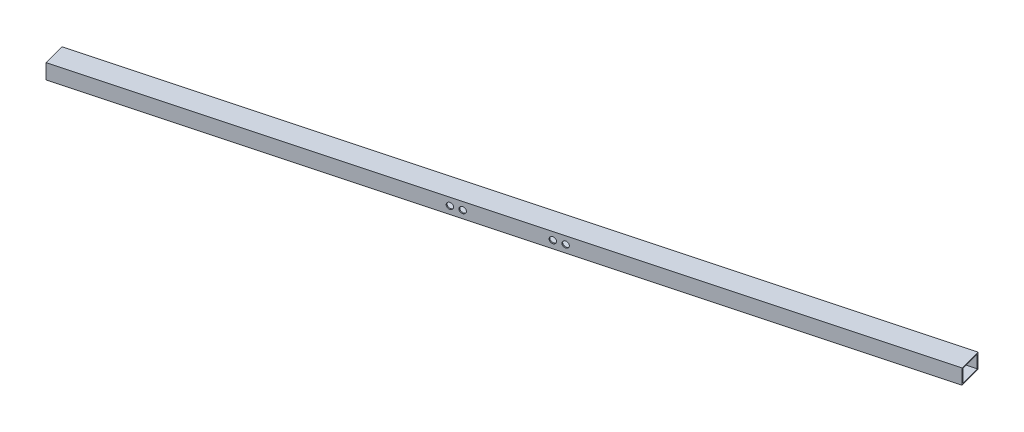
ISO-10303-21;
HEADER;
FILE_DESCRIPTION(('STEP AP214'),'2;1');
FILE_NAME('part.step','',(''),(''),'','','');
FILE_SCHEMA(('AUTOMOTIVE_DESIGN { 1 0 10303 214 1 1 1 1 }'));
ENDSEC;
DATA;
#1=APPLICATION_CONTEXT('core data for automotive mechanical design processes');
#2=APPLICATION_PROTOCOL_DEFINITION('international standard','automotive_design',2000,#1);
#3=PRODUCT_CONTEXT('',#1,'mechanical');
#4=PRODUCT('Part','Part','',(#3));
#5=PRODUCT_RELATED_PRODUCT_CATEGORY('part','',(#4));
#6=PRODUCT_DEFINITION_FORMATION('','',#4);
#7=PRODUCT_DEFINITION_CONTEXT('part definition',#1,'design');
#8=PRODUCT_DEFINITION('design','',#6,#7);
#9=PRODUCT_DEFINITION_SHAPE('','',#8);
#10=(LENGTH_UNIT() NAMED_UNIT(*) SI_UNIT(.MILLI.,.METRE.));
#11=(NAMED_UNIT(*) PLANE_ANGLE_UNIT() SI_UNIT($,.RADIAN.));
#12=(NAMED_UNIT(*) SI_UNIT($,.STERADIAN.) SOLID_ANGLE_UNIT());
#13=UNCERTAINTY_MEASURE_WITH_UNIT(LENGTH_MEASURE(1.E-05),#10,'distance_accuracy_value','');
#14=(GEOMETRIC_REPRESENTATION_CONTEXT(3) GLOBAL_UNCERTAINTY_ASSIGNED_CONTEXT((#13)) GLOBAL_UNIT_ASSIGNED_CONTEXT((#10,
#11,#12)) REPRESENTATION_CONTEXT('',''));
#15=CARTESIAN_POINT('',(0.,0.,0.));
#16=DIRECTION('',(0.,0.,1.));
#17=DIRECTION('',(1.,0.,0.));
#18=AXIS2_PLACEMENT_3D('',#15,#16,#17);
#19=CARTESIAN_POINT('',(-122.2588190451,0.,2028.32641603));
#20=DIRECTION('',(0.258819045102985,0.,0.965925826288944));
#21=DIRECTION('',(0.965925826288944,0.,-0.258819045102985));
#22=AXIS2_PLACEMENT_3D('',#19,#20,#21);
#23=CYLINDRICAL_SURFACE('',#22,8.1);
#24=DIRECTION('',(0.258819045102985,0.,0.965925826288944));
#25=VECTOR('',#24,1.);
#26=CARTESIAN_POINT('',(-114.4348198521,0.,2026.229981765));
#27=LINE('',#26,#25);
#28=CARTESIAN_POINT('',(-99.42331523607,0.,2082.25367969));
#29=VERTEX_POINT('',#28);
#30=CARTESIAN_POINT('',(-98.64685810073,0.,2085.151457169));
#31=VERTEX_POINT('',#30);
#32=EDGE_CURVE('E11',#29,#31,#27,.T.);
#33=ORIENTED_EDGE('',*,*,#32,.F.);
#34=CARTESIAN_POINT('',(-107.247314429,0.,2084.350113955));
#35=DIRECTION('',(0.258819045102985,0.,0.965925826288944));
#36=DIRECTION('',(0.965925826288944,0.,-0.258819045102985));
#37=AXIS2_PLACEMENT_3D('',#34,#35,#36);
#38=CIRCLE('',#37,8.1);
#39=EDGE_CURVE('E225',#29,#29,#38,.T.);
#40=ORIENTED_EDGE('',*,*,#39,.F.);
#41=ORIENTED_EDGE('',*,*,#32,.T.);
#42=CARTESIAN_POINT('',(-106.4708572936,0.,2087.247891434));
#43=DIRECTION('',(0.258819045102985,0.,0.965925826288944));
#44=DIRECTION('',(0.965925826288944,0.,-0.258819045102985));
#45=AXIS2_PLACEMENT_3D('',#42,#43,#44);
#46=CIRCLE('',#45,8.1);
#47=EDGE_CURVE('E287',#31,#31,#46,.T.);
#48=ORIENTED_EDGE('',*,*,#47,.T.);
#49=EDGE_LOOP('',(#33,#40,#41,#48));
#50=FACE_BOUND('',#49,.T.);
#51=ADVANCED_FACE('F17',(#50),#23,.F.);
#52=CARTESIAN_POINT('',(-95.2588190451,0.,2021.091787834));
#53=DIRECTION('',(0.258819045102985,0.,0.965925826288944));
#54=DIRECTION('',(0.965925826288944,0.,-0.258819045102985));
#55=AXIS2_PLACEMENT_3D('',#52,#53,#54);
#56=CYLINDRICAL_SURFACE('',#55,8.1);
#57=DIRECTION('',(0.258819045102985,0.,0.965925826288944));
#58=VECTOR('',#57,1.);
#59=CARTESIAN_POINT('',(-87.43481985216,0.,2018.995353569));
#60=LINE('',#59,#58);
#61=CARTESIAN_POINT('',(-72.42331523607,0.,2075.019051494));
#62=VERTEX_POINT('',#61);
#63=CARTESIAN_POINT('',(-71.64685810073,0.,2077.916828973));
#64=VERTEX_POINT('',#63);
#65=EDGE_CURVE('E25',#62,#64,#60,.T.);
#66=ORIENTED_EDGE('',*,*,#65,.F.);
#67=CARTESIAN_POINT('',(-80.24731442901,0.,2077.115485759));
#68=DIRECTION('',(0.258819045102985,0.,0.965925826288944));
#69=DIRECTION('',(0.965925826288944,0.,-0.258819045102985));
#70=AXIS2_PLACEMENT_3D('',#67,#68,#69);
#71=CIRCLE('',#70,8.1);
#72=EDGE_CURVE('E242',#62,#62,#71,.T.);
#73=ORIENTED_EDGE('',*,*,#72,.F.);
#74=ORIENTED_EDGE('',*,*,#65,.T.);
#75=CARTESIAN_POINT('',(-79.47085729367,0.,2080.013263238));
#76=DIRECTION('',(0.258819045102985,0.,0.965925826288944));
#77=DIRECTION('',(0.965925826288944,0.,-0.258819045102985));
#78=AXIS2_PLACEMENT_3D('',#75,#76,#77);
#79=CIRCLE('',#78,8.1);
#80=EDGE_CURVE('E329',#64,#64,#79,.T.);
#81=ORIENTED_EDGE('',*,*,#80,.T.);
#82=EDGE_LOOP('',(#66,#73,#74,#81));
#83=FACE_BOUND('',#82,.T.);
#84=ADVANCED_FACE('F346',(#83),#56,.F.);
#85=CARTESIAN_POINT('',(94.741180954897,0.,1970.181441272));
#86=DIRECTION('',(0.258819045102985,0.,0.965925826288944));
#87=DIRECTION('',(0.965925826288944,0.,-0.258819045102985));
#88=AXIS2_PLACEMENT_3D('',#85,#86,#87);
#89=CYLINDRICAL_SURFACE('',#88,8.1);
#90=DIRECTION('',(0.258819045102985,0.,0.965925826288944));
#91=VECTOR('',#90,1.);
#92=CARTESIAN_POINT('',(102.56518014783,0.,1968.085007007));
#93=LINE('',#92,#91);
#94=CARTESIAN_POINT('',(117.57668476389,0.,2024.108704932));
#95=VERTEX_POINT('',#94);
#96=CARTESIAN_POINT('',(118.35314189923,0.,2027.006482411));
#97=VERTEX_POINT('',#96);
#98=EDGE_CURVE('E342',#95,#97,#93,.T.);
#99=ORIENTED_EDGE('',*,*,#98,.F.);
#100=CARTESIAN_POINT('',(109.75268557095,0.,2026.205139197));
#101=DIRECTION('',(0.258819045102985,0.,0.965925826288944));
#102=DIRECTION('',(0.965925826288944,0.,-0.258819045102985));
#103=AXIS2_PLACEMENT_3D('',#100,#101,#102);
#104=CIRCLE('',#103,8.1);
#105=EDGE_CURVE('E238',#95,#95,#104,.T.);
#106=ORIENTED_EDGE('',*,*,#105,.F.);
#107=ORIENTED_EDGE('',*,*,#98,.T.);
#108=CARTESIAN_POINT('',(110.52914270629,0.,2029.102916676));
#109=DIRECTION('',(0.258819045102985,0.,0.965925826288944));
#110=DIRECTION('',(0.965925826288944,0.,-0.258819045102985));
#111=AXIS2_PLACEMENT_3D('',#108,#109,#110);
#112=CIRCLE('',#111,8.1);
#113=EDGE_CURVE('E325',#97,#97,#112,.T.);
#114=ORIENTED_EDGE('',*,*,#113,.T.);
#115=EDGE_LOOP('',(#99,#106,#107,#114));
#116=FACE_BOUND('',#115,.T.);
#117=ADVANCED_FACE('F387',(#116),#89,.F.);
#118=CARTESIAN_POINT('',(121.74118095489,0.,1962.946813077));
#119=DIRECTION('',(0.258819045102985,0.,0.965925826288944));
#120=DIRECTION('',(0.965925826288944,0.,-0.258819045102985));
#121=AXIS2_PLACEMENT_3D('',#118,#119,#120);
#122=CYLINDRICAL_SURFACE('',#121,8.1);
#123=DIRECTION('',(0.258819045102985,0.,0.965925826288944));
#124=VECTOR('',#123,1.);
#125=CARTESIAN_POINT('',(129.56518014783,0.,1960.850378811));
#126=LINE('',#125,#124);
#127=CARTESIAN_POINT('',(144.57668476389,0.,2016.874076736));
#128=VERTEX_POINT('',#127);
#129=CARTESIAN_POINT('',(145.35314189923,0.,2019.771854215));
#130=VERTEX_POINT('',#129);
#131=EDGE_CURVE('E224',#128,#130,#126,.T.);
#132=ORIENTED_EDGE('',*,*,#131,.F.);
#133=CARTESIAN_POINT('',(136.75268557095,0.,2018.970511002));
#134=DIRECTION('',(0.258819045102985,0.,0.965925826288944));
#135=DIRECTION('',(0.965925826288944,0.,-0.258819045102985));
#136=AXIS2_PLACEMENT_3D('',#133,#134,#135);
#137=CIRCLE('',#136,8.1);
#138=EDGE_CURVE('E243',#128,#128,#137,.T.);
#139=ORIENTED_EDGE('',*,*,#138,.F.);
#140=ORIENTED_EDGE('',*,*,#131,.T.);
#141=CARTESIAN_POINT('',(137.52914270629,0.,2021.868288481));
#142=DIRECTION('',(0.258819045102985,0.,0.965925826288944));
#143=DIRECTION('',(0.965925826288944,0.,-0.258819045102985));
#144=AXIS2_PLACEMENT_3D('',#141,#142,#143);
#145=CIRCLE('',#144,8.1);
#146=EDGE_CURVE('E206',#130,#130,#145,.T.);
#147=ORIENTED_EDGE('',*,*,#146,.T.);
#148=EDGE_LOOP('',(#132,#139,#140,#147));
#149=FACE_BOUND('',#148,.T.);
#150=ADVANCED_FACE('F377',(#149),#122,.F.);
#151=CARTESIAN_POINT('',(-972.9139405062,-17.,2260.399873585));
#152=DIRECTION('',(0.258819045102985,0.,0.965925826288944));
#153=DIRECTION('',(0.,-1.,0.));
#154=AXIS2_PLACEMENT_3D('',#151,#152,#153);
#155=PLANE('',#154);
#156=CARTESIAN_POINT('',(-121.2235428646,0.,2032.190119335));
#157=DIRECTION('',(0.258819045102985,0.,0.965925826288944));
#158=DIRECTION('',(0.965925826288944,0.,-0.258819045102985));
#159=AXIS2_PLACEMENT_3D('',#156,#157,#158);
#160=CIRCLE('',#159,8.1);
#161=CARTESIAN_POINT('',(-113.3995436717,0.,2030.09368507));
#162=VERTEX_POINT('',#161);
#163=EDGE_CURVE('E205',#162,#162,#160,.T.);
#164=ORIENTED_EDGE('',*,*,#163,.F.);
#165=EDGE_LOOP('',(#164));
#166=FACE_BOUND('',#165,.T.);
#167=CARTESIAN_POINT('',(-94.22354286464,0.,2024.95549114));
#168=DIRECTION('',(0.258819045102985,0.,0.965925826288944));
#169=DIRECTION('',(0.965925826288944,0.,-0.258819045102985));
#170=AXIS2_PLACEMENT_3D('',#167,#168,#169);
#171=CIRCLE('',#170,8.1);
#172=CARTESIAN_POINT('',(-86.3995436717,0.,2022.859056874));
#173=VERTEX_POINT('',#172);
#174=EDGE_CURVE('E316',#173,#173,#171,.T.);
#175=ORIENTED_EDGE('',*,*,#174,.F.);
#176=EDGE_LOOP('',(#175));
#177=FACE_BOUND('',#176,.T.);
#178=CARTESIAN_POINT('',(95.776457135327,0.,1974.045144578));
#179=DIRECTION('',(0.258819045102985,0.,0.965925826288944));
#180=DIRECTION('',(0.965925826288944,0.,-0.258819045102985));
#181=AXIS2_PLACEMENT_3D('',#178,#179,#180);
#182=CIRCLE('',#181,8.1);
#183=CARTESIAN_POINT('',(103.60045632826,0.,1971.948710312));
#184=VERTEX_POINT('',#183);
#185=EDGE_CURVE('E305',#184,#184,#182,.T.);
#186=ORIENTED_EDGE('',*,*,#185,.F.);
#187=EDGE_LOOP('',(#186));
#188=FACE_BOUND('',#187,.T.);
#189=CARTESIAN_POINT('',(122.77645713532,0.,1966.810516382));
#190=DIRECTION('',(0.258819045102985,0.,0.965925826288944));
#191=DIRECTION('',(0.965925826288944,0.,-0.258819045102985));
#192=AXIS2_PLACEMENT_3D('',#189,#190,#191);
#193=CIRCLE('',#192,8.1);
#194=CARTESIAN_POINT('',(130.60045632826,0.,1964.714082117));
#195=VERTEX_POINT('',#194);
#196=EDGE_CURVE('E298',#195,#195,#193,.T.);
#197=ORIENTED_EDGE('',*,*,#196,.F.);
#198=EDGE_LOOP('',(#197));
#199=FACE_BOUND('',#198,.T.);
#200=DIRECTION('',(0.965925826288944,0.,-0.258819045102985));
#201=VECTOR('',#200,1.);
#202=CARTESIAN_POINT('',(-972.9139405062,-17.,2260.399873585));
#203=LINE('',#202,#201);
#204=CARTESIAN_POINT('',(-972.9139405062,-17.,2260.399873585));
#205=VERTEX_POINT('',#204);
#206=CARTESIAN_POINT('',(958.93771207186,-17.,1742.76178338));
#207=VERTEX_POINT('',#206);
#208=EDGE_CURVE('E286',#205,#207,#203,.T.);
#209=ORIENTED_EDGE('',*,*,#208,.T.);
#210=DIRECTION('',(0.,1.,0.));
#211=VECTOR('',#210,1.);
#212=CARTESIAN_POINT('',(958.93771207186,-17.,1742.76178338));
#213=LINE('',#212,#211);
#214=CARTESIAN_POINT('',(958.93771207186,17.,1742.76178338));
#215=VERTEX_POINT('',#214);
#216=EDGE_CURVE('E282',#207,#215,#213,.T.);
#217=ORIENTED_EDGE('',*,*,#216,.T.);
#218=DIRECTION('',(0.965925826288944,0.,-0.258819045102985));
#219=VECTOR('',#218,1.);
#220=CARTESIAN_POINT('',(-972.9139405062,17.,2260.399873585));
#221=LINE('',#220,#219);
#222=CARTESIAN_POINT('',(-972.9139405062,17.,2260.399873585));
#223=VERTEX_POINT('',#222);
#224=EDGE_CURVE('E221',#223,#215,#221,.T.);
#225=ORIENTED_EDGE('',*,*,#224,.F.);
#226=DIRECTION('',(0.,1.,0.));
#227=VECTOR('',#226,1.);
#228=CARTESIAN_POINT('',(-972.9139405062,-17.,2260.399873585));
#229=LINE('',#228,#227);
#230=EDGE_CURVE('E246',#205,#223,#229,.T.);
#231=ORIENTED_EDGE('',*,*,#230,.F.);
#232=EDGE_LOOP('',(#209,#217,#225,#231));
#233=FACE_BOUND('',#232,.T.);
#234=ADVANCED_FACE('F375',(#166,#177,#188,#199,#233),#155,.T.);
#235=CARTESIAN_POINT('',(-972.9139405062,17.,2260.399873585));
#236=DIRECTION('',(0.,-1.,0.));
#237=DIRECTION('',(0.,0.,-1.));
#238=AXIS2_PLACEMENT_3D('',#235,#236,#237);
#239=PLANE('',#238);
#240=ORIENTED_EDGE('',*,*,#224,.T.);
#241=DIRECTION('',(0.258819045102985,0.,0.965925826288944));
#242=VECTOR('',#241,1.);
#243=CARTESIAN_POINT('',(958.93771207186,17.,1742.76178338));
#244=LINE('',#243,#242);
#245=CARTESIAN_POINT('',(972.9139405074,17.,1794.921778));
#246=VERTEX_POINT('',#245);
#247=EDGE_CURVE('E278',#215,#246,#244,.T.);
#248=ORIENTED_EDGE('',*,*,#247,.T.);
#249=DIRECTION('',(0.965925826288944,0.,-0.258819045102985));
#250=VECTOR('',#249,1.);
#251=CARTESIAN_POINT('',(-958.9377120707,17.,2312.559868205));
#252=LINE('',#251,#250);
#253=CARTESIAN_POINT('',(-958.9377120707,17.,2312.559868205));
#254=VERTEX_POINT('',#253);
#255=EDGE_CURVE('E309',#254,#246,#252,.T.);
#256=ORIENTED_EDGE('',*,*,#255,.F.);
#257=DIRECTION('',(0.258819045102985,0.,0.965925826288944));
#258=VECTOR('',#257,1.);
#259=CARTESIAN_POINT('',(-972.9139405062,17.,2260.399873585));
#260=LINE('',#259,#258);
#261=EDGE_CURVE('E220',#223,#254,#260,.T.);
#262=ORIENTED_EDGE('',*,*,#261,.F.);
#263=EDGE_LOOP('',(#240,#248,#256,#262));
#264=FACE_BOUND('',#263,.T.);
#265=ADVANCED_FACE('F353',(#264),#239,.T.);
#266=CARTESIAN_POINT('',(-958.9377120707,17.,2312.559868205));
#267=DIRECTION('',(-0.258819045102985,0.,-0.965925826288944));
#268=DIRECTION('',(-0.965925826288944,0.,0.258819045102985));
#269=AXIS2_PLACEMENT_3D('',#266,#267,#268);
#270=PLANE('',#269);
#271=ORIENTED_EDGE('',*,*,#39,.T.);
#272=EDGE_LOOP('',(#271));
#273=FACE_BOUND('',#272,.T.);
#274=ORIENTED_EDGE('',*,*,#72,.T.);
#275=EDGE_LOOP('',(#274));
#276=FACE_BOUND('',#275,.T.);
#277=ORIENTED_EDGE('',*,*,#105,.T.);
#278=EDGE_LOOP('',(#277));
#279=FACE_BOUND('',#278,.T.);
#280=ORIENTED_EDGE('',*,*,#138,.T.);
#281=EDGE_LOOP('',(#280));
#282=FACE_BOUND('',#281,.T.);
#283=ORIENTED_EDGE('',*,*,#255,.T.);
#284=DIRECTION('',(0.,-1.,0.));
#285=VECTOR('',#284,1.);
#286=CARTESIAN_POINT('',(972.9139405074,17.,1794.921778));
#287=LINE('',#286,#285);
#288=CARTESIAN_POINT('',(972.9139405074,-17.,1794.921778));
#289=VERTEX_POINT('',#288);
#290=EDGE_CURVE('E274',#246,#289,#287,.T.);
#291=ORIENTED_EDGE('',*,*,#290,.T.);
#292=DIRECTION('',(0.965925826288944,0.,-0.258819045102985));
#293=VECTOR('',#292,1.);
#294=CARTESIAN_POINT('',(-958.9377120707,-17.,2312.559868205));
#295=LINE('',#294,#293);
#296=CARTESIAN_POINT('',(-958.9377120707,-17.,2312.559868205));
#297=VERTEX_POINT('',#296);
#298=EDGE_CURVE('E283',#297,#289,#295,.T.);
#299=ORIENTED_EDGE('',*,*,#298,.F.);
#300=DIRECTION('',(0.,-1.,0.));
#301=VECTOR('',#300,1.);
#302=CARTESIAN_POINT('',(-958.9377120707,17.,2312.559868205));
#303=LINE('',#302,#301);
#304=EDGE_CURVE('E215',#254,#297,#303,.T.);
#305=ORIENTED_EDGE('',*,*,#304,.F.);
#306=EDGE_LOOP('',(#283,#291,#299,#305));
#307=FACE_BOUND('',#306,.T.);
#308=ADVANCED_FACE('F349',(#273,#276,#279,#282,#307),#270,.T.);
#309=CARTESIAN_POINT('',(-958.9377120707,-17.,2312.559868205));
#310=DIRECTION('',(0.,1.,0.));
#311=DIRECTION('',(1.,0.,0.));
#312=AXIS2_PLACEMENT_3D('',#309,#310,#311);
#313=PLANE('',#312);
#314=ORIENTED_EDGE('',*,*,#298,.T.);
#315=DIRECTION('',(-0.258819045102985,0.,-0.965925826288944));
#316=VECTOR('',#315,1.);
#317=CARTESIAN_POINT('',(972.9139405074,-17.,1794.921778));
#318=LINE('',#317,#316);
#319=EDGE_CURVE('E270',#289,#207,#318,.T.);
#320=ORIENTED_EDGE('',*,*,#319,.T.);
#321=ORIENTED_EDGE('',*,*,#208,.F.);
#322=DIRECTION('',(-0.258819045102985,0.,-0.965925826288944));
#323=VECTOR('',#322,1.);
#324=CARTESIAN_POINT('',(-958.9377120707,-17.,2312.559868205));
#325=LINE('',#324,#323);
#326=EDGE_CURVE('E219',#297,#205,#325,.T.);
#327=ORIENTED_EDGE('',*,*,#326,.F.);
#328=EDGE_LOOP('',(#314,#320,#321,#327));
#329=FACE_BOUND('',#328,.T.);
#330=ADVANCED_FACE('F352',(#329),#313,.T.);
#331=CARTESIAN_POINT('',(-958.1612549354,20.,2315.457645684));
#332=DIRECTION('',(-0.258819045102985,0.,-0.965925826288944));
#333=DIRECTION('',(-0.965925826288944,0.,0.258819045102985));
#334=AXIS2_PLACEMENT_3D('',#331,#332,#333);
#335=PLANE('',#334);
#336=ORIENTED_EDGE('',*,*,#47,.F.);
#337=EDGE_LOOP('',(#336));
#338=FACE_BOUND('',#337,.T.);
#339=ORIENTED_EDGE('',*,*,#80,.F.);
#340=EDGE_LOOP('',(#339));
#341=FACE_BOUND('',#340,.T.);
#342=ORIENTED_EDGE('',*,*,#113,.F.);
#343=EDGE_LOOP('',(#342));
#344=FACE_BOUND('',#343,.T.);
#345=ORIENTED_EDGE('',*,*,#146,.F.);
#346=EDGE_LOOP('',(#345));
#347=FACE_BOUND('',#346,.T.);
#348=DIRECTION('',(0.,-1.,0.));
#349=VECTOR('',#348,1.);
#350=CARTESIAN_POINT('',(-958.1612549354,20.,2315.457645684));
#351=LINE('',#350,#349);
#352=CARTESIAN_POINT('',(-958.1612549354,20.,2315.457645684));
#353=VERTEX_POINT('',#352);
#354=CARTESIAN_POINT('',(-958.1612549354,-20.,2315.457645684));
#355=VERTEX_POINT('',#354);
#356=EDGE_CURVE('E247',#353,#355,#351,.T.);
#357=ORIENTED_EDGE('',*,*,#356,.T.);
#358=DIRECTION('',(0.965925826288944,0.,-0.258819045102985));
#359=VECTOR('',#358,1.);
#360=CARTESIAN_POINT('',(-958.1612549354,-20.,2315.457645684));
#361=LINE('',#360,#359);
#362=CARTESIAN_POINT('',(973.69039764271,-20.,1797.819555479));
#363=VERTEX_POINT('',#362);
#364=EDGE_CURVE('E175',#355,#363,#361,.T.);
#365=ORIENTED_EDGE('',*,*,#364,.T.);
#366=DIRECTION('',(0.,-1.,0.));
#367=VECTOR('',#366,1.);
#368=CARTESIAN_POINT('',(973.69039764271,20.,1797.819555479));
#369=LINE('',#368,#367);
#370=CARTESIAN_POINT('',(973.69039764271,20.,1797.819555479));
#371=VERTEX_POINT('',#370);
#372=EDGE_CURVE('E265',#371,#363,#369,.T.);
#373=ORIENTED_EDGE('',*,*,#372,.F.);
#374=DIRECTION('',(0.965925826288944,0.,-0.258819045102985));
#375=VECTOR('',#374,1.);
#376=CARTESIAN_POINT('',(-958.1612549354,20.,2315.457645684));
#377=LINE('',#376,#375);
#378=EDGE_CURVE('E291',#353,#371,#377,.T.);
#379=ORIENTED_EDGE('',*,*,#378,.F.);
#380=EDGE_LOOP('',(#357,#365,#373,#379));
#381=FACE_BOUND('',#380,.T.);
#382=ADVANCED_FACE('F434',(#338,#341,#344,#347,#381),#335,.F.);
#383=CARTESIAN_POINT('',(-122.2588190451,0.,2028.32641603));
#384=DIRECTION('',(0.258819045102985,0.,0.965925826288944));
#385=DIRECTION('',(0.965925826288944,0.,-0.258819045102985));
#386=AXIS2_PLACEMENT_3D('',#383,#384,#385);
#387=CYLINDRICAL_SURFACE('',#386,8.1);
#388=DIRECTION('',(0.258819045102985,0.,0.965925826288944));
#389=VECTOR('',#388,1.);
#390=CARTESIAN_POINT('',(-114.4348198521,0.,2026.229981765));
#391=LINE('',#390,#389);
#392=CARTESIAN_POINT('',(-114.176000807,0.,2027.195907591));
#393=VERTEX_POINT('',#392);
#394=EDGE_CURVE('E207',#393,#162,#391,.T.);
#395=ORIENTED_EDGE('',*,*,#394,.F.);
#396=CARTESIAN_POINT('',(-121.9999999999,0.,2029.292341856));
#397=DIRECTION('',(0.258819045102985,0.,0.965925826288944));
#398=DIRECTION('',(0.965925826288944,0.,-0.258819045102985));
#399=AXIS2_PLACEMENT_3D('',#396,#397,#398);
#400=CIRCLE('',#399,8.1);
#401=EDGE_CURVE('E181',#393,#393,#400,.T.);
#402=ORIENTED_EDGE('',*,*,#401,.F.);
#403=ORIENTED_EDGE('',*,*,#394,.T.);
#404=ORIENTED_EDGE('',*,*,#163,.T.);
#405=EDGE_LOOP('',(#395,#402,#403,#404));
#406=FACE_BOUND('',#405,.T.);
#407=ADVANCED_FACE('F415',(#406),#387,.F.);
#408=CARTESIAN_POINT('',(-95.2588190451,0.,2021.091787834));
#409=DIRECTION('',(0.258819045102985,0.,0.965925826288944));
#410=DIRECTION('',(0.965925826288944,0.,-0.258819045102985));
#411=AXIS2_PLACEMENT_3D('',#408,#409,#410);
#412=CYLINDRICAL_SURFACE('',#411,8.1);
#413=DIRECTION('',(0.258819045102985,0.,0.965925826288944));
#414=VECTOR('',#413,1.);
#415=CARTESIAN_POINT('',(-87.43481985216,0.,2018.995353569));
#416=LINE('',#415,#414);
#417=CARTESIAN_POINT('',(-87.17600080704,0.,2019.961279395));
#418=VERTEX_POINT('',#417);
#419=EDGE_CURVE('E312',#418,#173,#416,.T.);
#420=ORIENTED_EDGE('',*,*,#419,.F.);
#421=CARTESIAN_POINT('',(-94.99999999998,0.,2022.057713661));
#422=DIRECTION('',(0.258819045102985,0.,0.965925826288944));
#423=DIRECTION('',(0.965925826288944,0.,-0.258819045102985));
#424=AXIS2_PLACEMENT_3D('',#421,#422,#423);
#425=CIRCLE('',#424,8.1);
#426=EDGE_CURVE('E213',#418,#418,#425,.T.);
#427=ORIENTED_EDGE('',*,*,#426,.F.);
#428=ORIENTED_EDGE('',*,*,#419,.T.);
#429=ORIENTED_EDGE('',*,*,#174,.T.);
#430=EDGE_LOOP('',(#420,#427,#428,#429));
#431=FACE_BOUND('',#430,.T.);
#432=ADVANCED_FACE('F411',(#431),#412,.F.);
#433=CARTESIAN_POINT('',(94.741180954897,0.,1970.181441272));
#434=DIRECTION('',(0.258819045102985,0.,0.965925826288944));
#435=DIRECTION('',(0.965925826288944,0.,-0.258819045102985));
#436=AXIS2_PLACEMENT_3D('',#433,#434,#435);
#437=CYLINDRICAL_SURFACE('',#436,8.1);
#438=DIRECTION('',(0.258819045102985,0.,0.965925826288944));
#439=VECTOR('',#438,1.);
#440=CARTESIAN_POINT('',(102.56518014783,0.,1968.085007007));
#441=LINE('',#440,#439);
#442=CARTESIAN_POINT('',(102.82399919292,0.,1969.050932833));
#443=VERTEX_POINT('',#442);
#444=EDGE_CURVE('E301',#443,#184,#441,.T.);
#445=ORIENTED_EDGE('',*,*,#444,.F.);
#446=CARTESIAN_POINT('',(94.999999999987,0.,1971.147367099));
#447=DIRECTION('',(0.258819045102985,0.,0.965925826288944));
#448=DIRECTION('',(0.965925826288944,0.,-0.258819045102985));
#449=AXIS2_PLACEMENT_3D('',#446,#447,#448);
#450=CIRCLE('',#449,8.1);
#451=EDGE_CURVE('E229',#443,#443,#450,.T.);
#452=ORIENTED_EDGE('',*,*,#451,.F.);
#453=ORIENTED_EDGE('',*,*,#444,.T.);
#454=ORIENTED_EDGE('',*,*,#185,.T.);
#455=EDGE_LOOP('',(#445,#452,#453,#454));
#456=FACE_BOUND('',#455,.T.);
#457=ADVANCED_FACE('F414',(#456),#437,.F.);
#458=CARTESIAN_POINT('',(121.74118095489,0.,1962.946813077));
#459=DIRECTION('',(0.258819045102985,0.,0.965925826288944));
#460=DIRECTION('',(0.965925826288944,0.,-0.258819045102985));
#461=AXIS2_PLACEMENT_3D('',#458,#459,#460);
#462=CYLINDRICAL_SURFACE('',#461,8.1);
#463=DIRECTION('',(0.258819045102985,0.,0.965925826288944));
#464=VECTOR('',#463,1.);
#465=CARTESIAN_POINT('',(129.56518014783,0.,1960.850378811));
#466=LINE('',#465,#464);
#467=CARTESIAN_POINT('',(129.82399919292,0.,1961.816304638));
#468=VERTEX_POINT('',#467);
#469=EDGE_CURVE('E294',#468,#195,#466,.T.);
#470=ORIENTED_EDGE('',*,*,#469,.F.);
#471=CARTESIAN_POINT('',(121.99999999998,0.,1963.912738903));
#472=DIRECTION('',(0.258819045102985,0.,0.965925826288944));
#473=DIRECTION('',(0.965925826288944,0.,-0.258819045102985));
#474=AXIS2_PLACEMENT_3D('',#471,#472,#473);
#475=CIRCLE('',#474,8.1);
#476=EDGE_CURVE('E191',#468,#468,#475,.T.);
#477=ORIENTED_EDGE('',*,*,#476,.F.);
#478=ORIENTED_EDGE('',*,*,#469,.T.);
#479=ORIENTED_EDGE('',*,*,#196,.T.);
#480=EDGE_LOOP('',(#470,#477,#478,#479));
#481=FACE_BOUND('',#480,.T.);
#482=ADVANCED_FACE('F423',(#481),#462,.F.);
#483=CARTESIAN_POINT('',(-973.6903976415,20.,2257.502096106));
#484=DIRECTION('',(0.,-1.,0.));
#485=DIRECTION('',(0.,0.,-1.));
#486=AXIS2_PLACEMENT_3D('',#483,#484,#485);
#487=PLANE('',#486);
#488=DIRECTION('',(0.258819045102985,0.,0.965925826288944));
#489=VECTOR('',#488,1.);
#490=CARTESIAN_POINT('',(-973.6903976415,20.,2257.502096106));
#491=LINE('',#490,#489);
#492=CARTESIAN_POINT('',(-973.6903976415,20.,2257.502096106));
#493=VERTEX_POINT('',#492);
#494=EDGE_CURVE('E195',#493,#353,#491,.T.);
#495=ORIENTED_EDGE('',*,*,#494,.T.);
#496=ORIENTED_EDGE('',*,*,#378,.T.);
#497=DIRECTION('',(0.258819045102985,0.,0.965925826288944));
#498=VECTOR('',#497,1.);
#499=CARTESIAN_POINT('',(958.16125493656,20.,1739.864005901));
#500=LINE('',#499,#498);
#501=CARTESIAN_POINT('',(958.16125493656,20.,1739.864005901));
#502=VERTEX_POINT('',#501);
#503=EDGE_CURVE('E261',#502,#371,#500,.T.);
#504=ORIENTED_EDGE('',*,*,#503,.F.);
#505=DIRECTION('',(0.965925826288944,0.,-0.258819045102985));
#506=VECTOR('',#505,1.);
#507=CARTESIAN_POINT('',(-973.6903976415,20.,2257.502096106));
#508=LINE('',#507,#506);
#509=EDGE_CURVE('E198',#493,#502,#508,.T.);
#510=ORIENTED_EDGE('',*,*,#509,.F.);
#511=EDGE_LOOP('',(#495,#496,#504,#510));
#512=FACE_BOUND('',#511,.T.);
#513=ADVANCED_FACE('F421',(#512),#487,.F.);
#514=CARTESIAN_POINT('',(965.92582628963,0.,1768.84178069));
#515=DIRECTION('',(0.965925826288944,0.,-0.258819045102985));
#516=DIRECTION('',(0.,-1.,0.));
#517=AXIS2_PLACEMENT_3D('',#514,#515,#516);
#518=PLANE('',#517);
#519=ORIENTED_EDGE('',*,*,#319,.F.);
#520=ORIENTED_EDGE('',*,*,#290,.F.);
#521=ORIENTED_EDGE('',*,*,#247,.F.);
#522=ORIENTED_EDGE('',*,*,#216,.F.);
#523=EDGE_LOOP('',(#519,#520,#521,#522));
#524=FACE_BOUND('',#523,.T.);
#525=DIRECTION('',(0.,1.,0.));
#526=VECTOR('',#525,1.);
#527=CARTESIAN_POINT('',(958.16125493656,-20.,1739.864005901));
#528=LINE('',#527,#526);
#529=CARTESIAN_POINT('',(958.16125493656,-20.,1739.864005901));
#530=VERTEX_POINT('',#529);
#531=EDGE_CURVE('E189',#530,#502,#528,.T.);
#532=ORIENTED_EDGE('',*,*,#531,.T.);
#533=ORIENTED_EDGE('',*,*,#503,.T.);
#534=ORIENTED_EDGE('',*,*,#372,.T.);
#535=DIRECTION('',(-0.258819045102985,0.,-0.965925826288944));
#536=VECTOR('',#535,1.);
#537=CARTESIAN_POINT('',(973.69039764271,-20.,1797.819555479));
#538=LINE('',#537,#536);
#539=EDGE_CURVE('E180',#363,#530,#538,.T.);
#540=ORIENTED_EDGE('',*,*,#539,.T.);
#541=EDGE_LOOP('',(#532,#533,#534,#540));
#542=FACE_BOUND('',#541,.T.);
#543=ADVANCED_FACE('F368',(#524,#542),#518,.T.);
#544=CARTESIAN_POINT('',(-965.9258262885,0.,2286.479870895));
#545=DIRECTION('',(0.965925826288944,0.,-0.258819045102985));
#546=DIRECTION('',(0.,-1.,0.));
#547=AXIS2_PLACEMENT_3D('',#544,#545,#546);
#548=PLANE('',#547);
#549=ORIENTED_EDGE('',*,*,#230,.T.);
#550=ORIENTED_EDGE('',*,*,#261,.T.);
#551=ORIENTED_EDGE('',*,*,#304,.T.);
#552=ORIENTED_EDGE('',*,*,#326,.T.);
#553=EDGE_LOOP('',(#549,#550,#551,#552));
#554=FACE_BOUND('',#553,.T.);
#555=DIRECTION('',(-0.258819045102985,0.,-0.965925826288944));
#556=VECTOR('',#555,1.);
#557=CARTESIAN_POINT('',(-958.1612549354,-20.,2315.457645684));
#558=LINE('',#557,#556);
#559=CARTESIAN_POINT('',(-973.6903976415,-20.,2257.502096106));
#560=VERTEX_POINT('',#559);
#561=EDGE_CURVE('E168',#355,#560,#558,.T.);
#562=ORIENTED_EDGE('',*,*,#561,.F.);
#563=ORIENTED_EDGE('',*,*,#356,.F.);
#564=ORIENTED_EDGE('',*,*,#494,.F.);
#565=DIRECTION('',(0.,1.,0.));
#566=VECTOR('',#565,1.);
#567=CARTESIAN_POINT('',(-973.6903976415,-20.,2257.502096106));
#568=LINE('',#567,#566);
#569=EDGE_CURVE('E187',#560,#493,#568,.T.);
#570=ORIENTED_EDGE('',*,*,#569,.F.);
#571=EDGE_LOOP('',(#562,#563,#564,#570));
#572=FACE_BOUND('',#571,.T.);
#573=ADVANCED_FACE('F193',(#554,#572),#548,.F.);
#574=CARTESIAN_POINT('',(-958.1612549354,-20.,2315.457645684));
#575=DIRECTION('',(0.,1.,0.));
#576=DIRECTION('',(1.,0.,0.));
#577=AXIS2_PLACEMENT_3D('',#574,#575,#576);
#578=PLANE('',#577);
#579=ORIENTED_EDGE('',*,*,#561,.T.);
#580=DIRECTION('',(0.965925826288944,0.,-0.258819045102985));
#581=VECTOR('',#580,1.);
#582=CARTESIAN_POINT('',(-973.6903976415,-20.,2257.502096106));
#583=LINE('',#582,#581);
#584=EDGE_CURVE('E172',#560,#530,#583,.T.);
#585=ORIENTED_EDGE('',*,*,#584,.T.);
#586=ORIENTED_EDGE('',*,*,#539,.F.);
#587=ORIENTED_EDGE('',*,*,#364,.F.);
#588=EDGE_LOOP('',(#579,#585,#586,#587));
#589=FACE_BOUND('',#588,.T.);
#590=ADVANCED_FACE('F170',(#589),#578,.F.);
#591=CARTESIAN_POINT('',(-973.6903976415,-20.,2257.502096106));
#592=DIRECTION('',(0.258819045102985,0.,0.965925826288944));
#593=DIRECTION('',(0.,-1.,0.));
#594=AXIS2_PLACEMENT_3D('',#591,#592,#593);
#595=PLANE('',#594);
#596=ORIENTED_EDGE('',*,*,#401,.T.);
#597=EDGE_LOOP('',(#596));
#598=FACE_BOUND('',#597,.T.);
#599=ORIENTED_EDGE('',*,*,#426,.T.);
#600=EDGE_LOOP('',(#599));
#601=FACE_BOUND('',#600,.T.);
#602=ORIENTED_EDGE('',*,*,#451,.T.);
#603=EDGE_LOOP('',(#602));
#604=FACE_BOUND('',#603,.T.);
#605=ORIENTED_EDGE('',*,*,#476,.T.);
#606=EDGE_LOOP('',(#605));
#607=FACE_BOUND('',#606,.T.);
#608=ORIENTED_EDGE('',*,*,#569,.T.);
#609=ORIENTED_EDGE('',*,*,#509,.T.);
#610=ORIENTED_EDGE('',*,*,#531,.F.);
#611=ORIENTED_EDGE('',*,*,#584,.F.);
#612=EDGE_LOOP('',(#608,#609,#610,#611));
#613=FACE_BOUND('',#612,.T.);
#614=ADVANCED_FACE('F185',(#598,#601,#604,#607,#613),#595,.F.);
#615=CLOSED_SHELL('',(#51,#84,#117,#150,#234,#265,#308,#330,#382,#407,#432,#457,#482,#513,#543,
#573,#590,#614));
#616=MANIFOLD_SOLID_BREP('B1',#615);
#617=ADVANCED_BREP_SHAPE_REPRESENTATION('',(#18,#616),#14);
#618=SHAPE_DEFINITION_REPRESENTATION(#9,#617);
ENDSEC;
END-ISO-10303-21;
